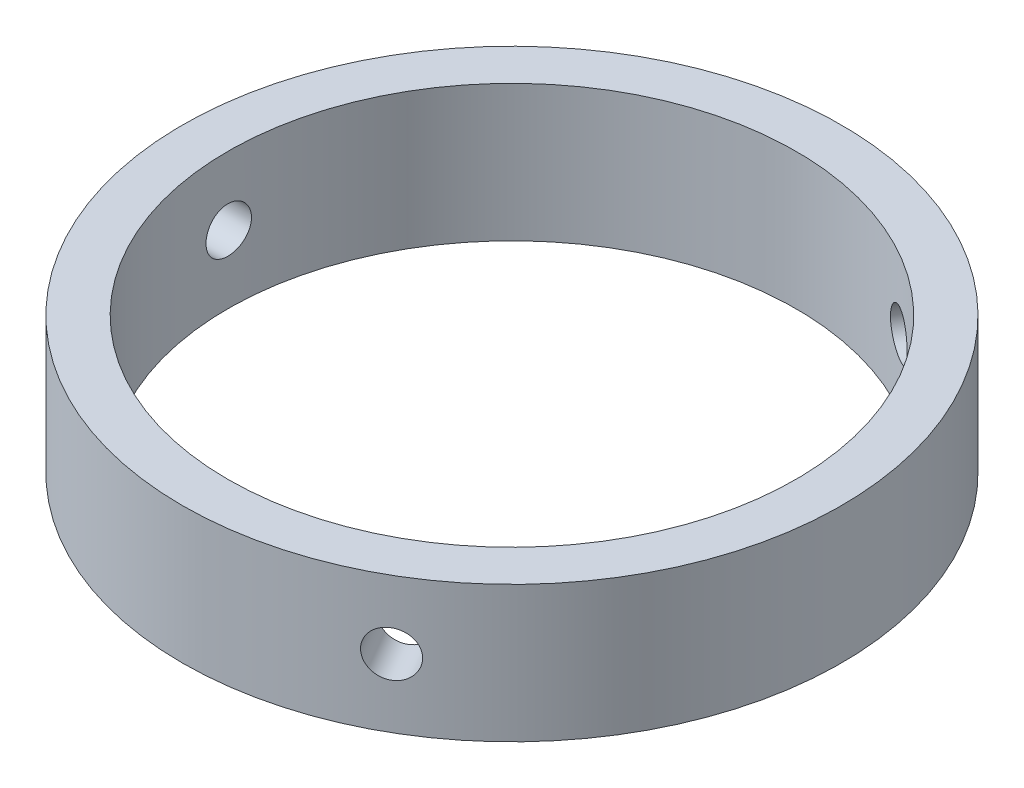
ISO-10303-21;
HEADER;
FILE_DESCRIPTION(('STEP AP214'),'2;1');
FILE_NAME('part.step','',(''),(''),'','','');
FILE_SCHEMA(('AUTOMOTIVE_DESIGN { 1 0 10303 214 1 1 1 1 }'));
ENDSEC;
DATA;
#1=APPLICATION_CONTEXT('core data for automotive mechanical design processes');
#2=APPLICATION_PROTOCOL_DEFINITION('international standard','automotive_design',2000,#1);
#3=PRODUCT_CONTEXT('',#1,'mechanical');
#4=PRODUCT('Part','Part','',(#3));
#5=PRODUCT_RELATED_PRODUCT_CATEGORY('part','',(#4));
#6=PRODUCT_DEFINITION_FORMATION('','',#4);
#7=PRODUCT_DEFINITION_CONTEXT('part definition',#1,'design');
#8=PRODUCT_DEFINITION('design','',#6,#7);
#9=PRODUCT_DEFINITION_SHAPE('','',#8);
#10=(LENGTH_UNIT() NAMED_UNIT(*) SI_UNIT(.MILLI.,.METRE.));
#11=(NAMED_UNIT(*) PLANE_ANGLE_UNIT() SI_UNIT($,.RADIAN.));
#12=(NAMED_UNIT(*) SI_UNIT($,.STERADIAN.) SOLID_ANGLE_UNIT());
#13=UNCERTAINTY_MEASURE_WITH_UNIT(LENGTH_MEASURE(1.E-05),#10,'distance_accuracy_value','');
#14=(GEOMETRIC_REPRESENTATION_CONTEXT(3) GLOBAL_UNCERTAINTY_ASSIGNED_CONTEXT((#13)) GLOBAL_UNIT_ASSIGNED_CONTEXT((#10,
#11,#12)) REPRESENTATION_CONTEXT('',''));
#15=CARTESIAN_POINT('',(0.,0.,0.));
#16=DIRECTION('',(0.,0.,1.));
#17=DIRECTION('',(1.,0.,0.));
#18=AXIS2_PLACEMENT_3D('',#15,#16,#17);
#19=CARTESIAN_POINT('',(0.,19.05,0.));
#20=DIRECTION('',(0.,1.,0.));
#21=DIRECTION('',(0.,0.,1.));
#22=AXIS2_PLACEMENT_3D('',#19,#20,#21);
#23=PLANE('',#22);
#24=CARTESIAN_POINT('',(0.,19.05,0.));
#25=DIRECTION('',(0.,1.,0.));
#26=DIRECTION('',(0.,0.,1.));
#27=AXIS2_PLACEMENT_3D('',#24,#25,#26);
#28=CIRCLE('',#27,46.0375);
#29=CARTESIAN_POINT('',(0.,19.05,46.0375));
#30=VERTEX_POINT('',#29);
#31=EDGE_CURVE('E10',#30,#30,#28,.T.);
#32=ORIENTED_EDGE('',*,*,#31,.T.);
#33=EDGE_LOOP('',(#32));
#34=FACE_BOUND('',#33,.T.);
#35=CARTESIAN_POINT('',(0.,19.05,0.));
#36=DIRECTION('',(0.,1.,0.));
#37=DIRECTION('',(0.,0.,1.));
#38=AXIS2_PLACEMENT_3D('',#35,#36,#37);
#39=CIRCLE('',#38,39.6875);
#40=CARTESIAN_POINT('',(0.,19.05,39.6875));
#41=VERTEX_POINT('',#40);
#42=EDGE_CURVE('E56',#41,#41,#39,.T.);
#43=ORIENTED_EDGE('',*,*,#42,.F.);
#44=EDGE_LOOP('',(#43));
#45=FACE_BOUND('',#44,.T.);
#46=ADVANCED_FACE('F37',(#34,#45),#23,.T.);
#47=CARTESIAN_POINT('',(0.,0.,0.));
#48=DIRECTION('',(0.,1.,0.));
#49=DIRECTION('',(0.,0.,1.));
#50=AXIS2_PLACEMENT_3D('',#47,#48,#49);
#51=PLANE('',#50);
#52=CARTESIAN_POINT('',(0.,0.,0.));
#53=DIRECTION('',(0.,1.,0.));
#54=DIRECTION('',(0.,0.,1.));
#55=AXIS2_PLACEMENT_3D('',#52,#53,#54);
#56=CIRCLE('',#55,46.0375);
#57=CARTESIAN_POINT('',(0.,0.,46.0375));
#58=VERTEX_POINT('',#57);
#59=EDGE_CURVE('E51',#58,#58,#56,.T.);
#60=ORIENTED_EDGE('',*,*,#59,.F.);
#61=EDGE_LOOP('',(#60));
#62=FACE_BOUND('',#61,.T.);
#63=CARTESIAN_POINT('',(0.,0.,0.));
#64=DIRECTION('',(0.,1.,0.));
#65=DIRECTION('',(0.,0.,1.));
#66=AXIS2_PLACEMENT_3D('',#63,#64,#65);
#67=CIRCLE('',#66,39.6875);
#68=CARTESIAN_POINT('',(0.,0.,39.6875));
#69=VERTEX_POINT('',#68);
#70=EDGE_CURVE('E59',#69,#69,#67,.T.);
#71=ORIENTED_EDGE('',*,*,#70,.T.);
#72=EDGE_LOOP('',(#71));
#73=FACE_BOUND('',#72,.T.);
#74=ADVANCED_FACE('F101',(#62,#73),#51,.F.);
#75=CARTESIAN_POINT('',(0.,19.05,0.));
#76=DIRECTION('',(0.,-1.,0.));
#77=DIRECTION('',(0.,0.,-1.));
#78=AXIS2_PLACEMENT_3D('',#75,#76,#77);
#79=CYLINDRICAL_SURFACE('',#78,46.0375);
#80=CARTESIAN_POINT('',(-45.927886749229,9.525,-3.175));
#81=CARTESIAN_POINT('',(-45.9278882117894,9.70311347048142,-3.17499217767791));
#82=CARTESIAN_POINT('',(-45.9289340108004,9.88135068965605,-3.15996170831043));
#83=CARTESIAN_POINT('',(-45.9330045505176,10.2329007552668,-3.10021951767123));
#84=CARTESIAN_POINT('',(-45.9360315774783,10.4062076709556,-3.05547350502673));
#85=CARTESIAN_POINT('',(-45.9437200863684,10.7427541707013,-2.93759409103095));
#86=CARTESIAN_POINT('',(-45.9483806875519,10.9059991240354,-2.86447598429968));
#87=CARTESIAN_POINT('',(-45.9588100949007,11.2178571674679,-2.69195339959439));
#88=CARTESIAN_POINT('',(-45.9645786519499,11.3664735353601,-2.59255482870735));
#89=CARTESIAN_POINT('',(-45.9765857110736,11.6451649626507,-2.37009773676865));
#90=CARTESIAN_POINT('',(-45.9828249464472,11.7752101374431,-2.24700181305405));
#91=CARTESIAN_POINT('',(-45.995063563711,12.0128115764183,-1.98072218918307));
#92=CARTESIAN_POINT('',(-46.0010629354572,12.1203668902903,-1.83753764060733));
#93=CARTESIAN_POINT('',(-46.0121523881866,12.3100298674662,-1.53497340579874));
#94=CARTESIAN_POINT('',(-46.0172415704449,12.3921124370123,-1.37557795374001));
#95=CARTESIAN_POINT('',(-46.0259294342189,12.5283392991642,-1.04522695645917));
#96=CARTESIAN_POINT('',(-46.0295281345186,12.5824839438664,-0.874271556955647));
#97=CARTESIAN_POINT('',(-46.0348244674008,12.6612140599927,-0.525944540446999));
#98=CARTESIAN_POINT('',(-46.0365251429467,12.6858468502784,-0.348583665617087));
#99=CARTESIAN_POINT('',(-46.0378440715752,12.705000195017,0.00776296761118296));
#100=CARTESIAN_POINT('',(-46.0374623524045,12.6995211506919,0.186748704327512));
#101=CARTESIAN_POINT('',(-46.0346620327918,12.6586452894488,0.540943712182851));
#102=CARTESIAN_POINT('',(-46.0322468974202,12.6232993672165,0.716158888016783));
#103=CARTESIAN_POINT('',(-46.0256555643908,12.5237721154098,1.05816333067813));
#104=CARTESIAN_POINT('',(-46.021479354521,12.4595905858751,1.22495253906679));
#105=CARTESIAN_POINT('',(-46.0118300077675,12.3041566196463,1.5455335004134));
#106=CARTESIAN_POINT('',(-46.0063557703298,12.2128811943145,1.69931407284338));
#107=CARTESIAN_POINT('',(-45.9947262025275,12.0058671222919,1.9893904205532));
#108=CARTESIAN_POINT('',(-45.9885708627757,11.8901281384192,2.12568595479475));
#109=CARTESIAN_POINT('',(-45.9762564285822,11.6371850780586,2.37722049513397));
#110=CARTESIAN_POINT('',(-45.9700973530046,11.4999368131453,2.49241507094369));
#111=CARTESIAN_POINT('',(-45.9584826160424,11.2080257474265,2.69813498713833));
#112=CARTESIAN_POINT('',(-45.9530269550079,11.0533629379528,2.78866031524395));
#113=CARTESIAN_POINT('',(-45.9434353180387,10.7309840219405,2.94246930316487));
#114=CARTESIAN_POINT('',(-45.9392994386493,10.5632669615671,3.00575097015748));
#115=CARTESIAN_POINT('',(-45.9328170776816,10.2195539011968,3.10324500770995));
#116=CARTESIAN_POINT('',(-45.9304705704406,10.0435580199705,3.13745779516722));
#117=CARTESIAN_POINT('',(-45.9278364104729,9.68867109423489,3.17578729509563));
#118=CARTESIAN_POINT('',(-45.9275445289821,9.50978675616839,3.17996582347681));
#119=CARTESIAN_POINT('',(-45.9290414841765,9.1538598571218,3.15826981908035));
#120=CARTESIAN_POINT('',(-45.9308303076419,8.97681728444736,3.1323954772421));
#121=CARTESIAN_POINT('',(-45.9362832352072,8.62977505074453,3.05137961099909));
#122=CARTESIAN_POINT('',(-45.9399455082287,8.45976868768736,2.99626666197553));
#123=CARTESIAN_POINT('',(-45.9487311044787,8.13141765639259,2.85836700764728));
#124=CARTESIAN_POINT('',(-45.9538544438319,7.97307311688193,2.7755799969233));
#125=CARTESIAN_POINT('',(-45.9649951056629,7.67225690264444,2.58452470434109));
#126=CARTESIAN_POINT('',(-45.9710138731838,7.5298115487195,2.47621506593184));
#127=CARTESIAN_POINT('',(-45.9832621592864,7.265102596431,2.2372490919754));
#128=CARTESIAN_POINT('',(-45.9894916803663,7.14283923739551,2.10659249146431));
#129=CARTESIAN_POINT('',(-46.0014719564844,6.92175546351427,1.82637510215911));
#130=CARTESIAN_POINT('',(-46.0072218829579,6.82297509556662,1.67678267722111));
#131=CARTESIAN_POINT('',(-46.0175831767384,6.65193555413031,1.36309869154094));
#132=CARTESIAN_POINT('',(-46.0221945523016,6.57967618832209,1.19900723595058));
#133=CARTESIAN_POINT('',(-46.029755250076,6.4637992440986,0.861129323712912));
#134=CARTESIAN_POINT('',(-46.0327060332563,6.42015648353776,0.687351537409144));
#135=CARTESIAN_POINT('',(-46.0366189267395,6.36266922595499,0.334913796263059));
#136=CARTESIAN_POINT('',(-46.0375810616588,6.3488243600814,0.156253901881383));
#137=CARTESIAN_POINT('',(-46.0374083172308,6.35132964742889,-0.200480663481208));
#138=CARTESIAN_POINT('',(-46.0362777851817,6.3676172036363,-0.378555779548015));
#139=CARTESIAN_POINT('',(-46.0320554204609,6.42979499099535,-0.729435978616245));
#140=CARTESIAN_POINT('',(-46.0289635845262,6.47568527139758,-0.902241052849301));
#141=CARTESIAN_POINT('',(-46.0211659498581,6.59575116384667,-1.23768364259167));
#142=CARTESIAN_POINT('',(-46.0164601812451,6.66992624802374,-1.40032134778525));
#143=CARTESIAN_POINT('',(-46.005962501132,6.84444810355691,-1.71084381667775));
#144=CARTESIAN_POINT('',(-46.0001706147058,6.94479427074846,-1.85872892083439));
#145=CARTESIAN_POINT('',(-45.9881374935953,7.16904289377915,-2.13586700221107));
#146=CARTESIAN_POINT('',(-45.9818954020557,7.29299104665192,-2.26508296516869));
#147=CARTESIAN_POINT('',(-45.9696724504867,7.56085529586682,-2.50092107200243));
#148=CARTESIAN_POINT('',(-45.9636916545653,7.70477625670419,-2.60753769563923));
#149=CARTESIAN_POINT('',(-45.9526591036659,8.00869684993096,-2.79524754821469));
#150=CARTESIAN_POINT('',(-45.9476086750847,8.16871894264595,-2.87630445274713));
#151=CARTESIAN_POINT('',(-45.9390253945794,8.50002180778776,-3.01029936524573));
#152=CARTESIAN_POINT('',(-45.9354907752685,8.67128919827424,-3.06327013790761));
#153=CARTESIAN_POINT('',(-45.9312608414718,8.95716185524869,-3.12589858504251));
#154=CARTESIAN_POINT('',(-45.930001256075,9.06992168355266,-3.14428762040432));
#155=CARTESIAN_POINT('',(-45.9283137420502,9.29677073655801,-3.16884082366096));
#156=CARTESIAN_POINT('',(-45.9278858119797,9.41085995895314,-3.17500501276047));
#157=CARTESIAN_POINT('',(-45.927886749229,9.525,-3.175));
#158=B_SPLINE_CURVE_WITH_KNOTS('',3,(#80,#81,#82,#83,#84,#85,#86,#87,#88,#89,#90,#91,#92,#93,
#94,#95,#96,#97,#98,#99,#100,#101,#102,#103,#104,#105,#106,#107,#108,#109,#110,#111,#112,#113,
#114,#115,#116,#117,#118,#119,#120,#121,#122,#123,#124,#125,#126,#127,#128,#129,#130,#131,#132,
#133,#134,#135,#136,#137,#138,#139,#140,#141,#142,#143,#144,#145,#146,#147,#148,#149,#150,#151,
#152,#153,#154,#155,#156,#157),.UNSPECIFIED.,.T.,.F.,(4,2,2,2,2,2,2,2,2,2,2,2,2,2,2,2,2,2,2,2,2,
2,2,2,2,2,2,2,2,2,2,2,2,2,2,2,2,2,4),(0.,0.533923711716308,1.06846463800663,1.60271780732995,
2.1368509939564,2.6718342447661,3.20684009676727,3.74237133382765,4.27789582152216,
4.81256050326147,5.34721806093408,5.88096636788996,6.41471837617887,6.94892456340053,
7.48313811407849,8.01846389225095,8.55378993688487,9.08915513296355,9.62451265086067,
10.1587679902998,10.6930199353932,11.2267507063691,11.7604873679533,12.2950949102194,
12.8297087916705,13.365227943754,13.9007432123929,14.4357866016373,14.9708233678373,
15.5047498979539,16.0386773163762,16.5725947707779,17.1064999006818,17.6414494608327,
18.1765295405177,18.7123666618025,19.2475773036409,19.5897309875491,19.9318840779721),.UNSPECIFIED.);
#159=CARTESIAN_POINT('',(-45.927886749229,9.525,-3.175));
#160=VERTEX_POINT('',#159);
#161=EDGE_CURVE('E161',#160,#160,#158,.T.);
#162=ORIENTED_EDGE('',*,*,#161,.T.);
#163=EDGE_LOOP('',(#162));
#164=FACE_BOUND('',#163,.T.);
#165=CARTESIAN_POINT('',(20.2143127175991,9.525,41.3622166669669));
#166=CARTESIAN_POINT('',(20.2143202232089,9.70311347048142,41.3622140224203));
#167=CARTESIAN_POINT('',(20.2278598910175,9.88135068965605,41.3556044762473));
#168=CARTESIAN_POINT('',(20.2816334156474,10.2329007552668,41.32925857173));
#169=CARTESIAN_POINT('',(20.3218981127959,10.4062076709556,41.3095070476537));
#170=CARTESIAN_POINT('',(20.4278289343446,10.7427541707013,41.2572257846718));
#171=CARTESIAN_POINT('',(20.4934813728422,10.9059991240354,41.224702930328));
#172=CARTESIAN_POINT('',(20.6481050175979,11.2178571674679,41.1474737696858));
#173=CARTESIAN_POINT('',(20.7370709836106,11.3664735353601,41.1027702011901));
#174=CARTESIAN_POINT('',(20.9357280060434,11.6451649626507,41.0019400734466));
#175=CARTESIAN_POINT('',(21.0454518207693,11.7752101374431,40.945795447923));
#176=CARTESIAN_POINT('',(21.2821760481836,12.0128115764183,40.8232545894452));
#177=CARTESIAN_POINT('',(21.4091771905527,12.1203668902903,40.7568579234962));
#178=CARTESIAN_POINT('',(21.6767502305383,12.3100298674662,40.6151795538697));
#179=CARTESIAN_POINT('',(21.817335332398,12.3921124370123,40.5398891889605));
#180=CARTESIAN_POINT('',(22.1077716200957,12.5283392991642,40.3822376010529));
#181=CARTESIAN_POINT('',(22.2576226891298,12.5824839438664,40.2998764671814));
#182=CARTESIAN_POINT('',(22.5619309006918,12.6612140599927,40.1302997177499));
#183=CARTESIAN_POINT('',(22.7163802617048,12.6858468502784,40.0430921085613));
#184=CARTESIAN_POINT('',(23.0256449629479,12.705000195017,39.8660610176453));
#185=CARTESIAN_POINT('',(23.1804602982739,12.6995211506919,39.7762375707881));
#186=CARTESIAN_POINT('',(23.4858020131639,12.6586452894488,39.5967149189372));
#187=CARTESIAN_POINT('',(23.6363352388788,12.6232993672165,39.5070157624348));
#188=CARTESIAN_POINT('',(23.929224107916,12.5237721154098,39.3303052792559));
#189=CARTESIAN_POINT('',(24.0715796945228,12.4595905858751,39.2432939712227));
#190=CARTESIAN_POINT('',(24.3443862776418,12.3041566196463,39.074646911131));
#191=CARTESIAN_POINT('',(24.4748270412559,12.2128811943145,38.9930157962286));
#192=CARTESIAN_POINT('',(24.7202257435084,12.0058671222919,38.8379061212218));
#193=CARTESIAN_POINT('',(24.8351834687081,11.8901281384192,38.7644276735071));
#194=CARTESIAN_POINT('',(25.0468615534743,11.6371850780586,38.6279957904927));
#195=CARTESIAN_POINT('',(25.143543444715,11.4999368131453,38.5650645866738));
#196=CARTESIAN_POINT('',(25.3158947497228,11.2080257474265,38.452145971309));
#197=CARTESIAN_POINT('',(25.3915641530309,11.0533629379528,38.4021585662058));
#198=CARTESIAN_POINT('',(25.5199708254162,10.7309840219405,38.3169474709662));
#199=CARTESIAN_POINT('',(25.5727064169309,10.5632669615671,38.2817248608516));
#200=CARTESIAN_POINT('',(25.653897549685,10.2195539011968,38.2273639528008));
#201=CARTESIAN_POINT('',(25.6823534391368,10.0435580199705,38.2082254241914));
#202=CARTESIAN_POINT('',(25.7142306798053,9.68867109423489,38.1867794247775));
#203=CARTESIAN_POINT('',(25.7177034507885,9.50978675616839,38.184437383801));
#204=CARTESIAN_POINT('',(25.6996626374177,9.1538598571218,38.1965817872258));
#205=CARTESIAN_POINT('',(25.6781492118123,8.97681728444736,38.2110681247089));
#206=CARTESIAN_POINT('',(25.6107138773189,8.62977505074453,38.256298431627));
#207=CARTESIAN_POINT('',(25.5648157998977,8.45976868768736,38.2870265276109));
#208=CARTESIAN_POINT('',(25.4497839942014,8.13141765639259,38.363584904315));
#209=CARTESIAN_POINT('',(25.3806500094876,7.97307311688193,38.409415351709));
#210=CARTESIAN_POINT('',(25.2207616034995,7.67225690264444,38.5145910941608));
#211=CARTESIAN_POINT('',(25.1299720889228,7.5298115487195,38.573958318938));
#212=CARTESIAN_POINT('',(24.9291456278878,7.265102596431,38.7040486328339));
#213=CARTESIAN_POINT('',(24.819108453213,7.14283923739551,38.7747718565981));
#214=CARTESIAN_POINT('',(24.5824232135516,6.92175546351427,38.9252557747132));
#215=CARTESIAN_POINT('',(24.4557473365783,6.82297509556662,39.0050315695782));
#216=CARTESIAN_POINT('',(24.1892696831092,6.6519355541303,39.1708467060483));
#217=CARTESIAN_POINT('',(24.0494680018056,6.57967618832208,39.2568860022276));
#218=CARTESIAN_POINT('',(23.7606374953173,6.4637992440986,39.4323727146894));
#219=CARTESIAN_POINT('',(23.6116169093549,6.42015648353775,39.5218170610364));
#220=CARTESIAN_POINT('',(23.3083533190116,6.36266922595499,39.7014245967682));
#221=CARTESIAN_POINT('',(23.1541103792993,6.34882436008139,39.7915877772411));
#222=CARTESIAN_POINT('',(22.8450828110733,6.35132964742889,39.9698054588594));
#223=CARTESIAN_POINT('',(22.6902999707531,6.3676172036363,40.0578639474185));
#224=CARTESIAN_POINT('',(22.3843176223146,6.42979499099535,40.2296473718403));
#225=CARTESIAN_POINT('',(22.2331181201586,6.47568527139758,40.3133723004931));
#226=CARTESIAN_POINT('',(21.9387174985964,6.59575116384668,40.4743406456522));
#227=CARTESIAN_POINT('',(21.7955162299791,6.66992624802374,40.5515841830859));
#228=CARTESIAN_POINT('',(21.5213470434157,6.84444810355691,40.6977541598733));
#229=CARTESIAN_POINT('',(21.3903788431617,6.94479427074847,40.7666807911708));
#230=CARTESIAN_POINT('',(21.1443536637781,7.16904289377915,40.8948288432906));
#231=CARTESIAN_POINT('',(21.0293283115126,7.29299104665192,40.9540310149234));
#232=CARTESIAN_POINT('',(20.8189750440296,7.56085529586682,41.0613646817722));
#233=CARTESIAN_POINT('',(20.7236519415337,7.70477625670419,41.1094934723878));
#234=CARTESIAN_POINT('',(20.555574165213,8.00869684993096,41.1937939293281));
#235=CARTESIAN_POINT('',(20.4828516124453,8.16871894264595,41.2299485821431));
#236=CARTESIAN_POINT('',(20.3625169739909,8.50002180778776,41.2895126994269));
#237=CARTESIAN_POINT('',(20.3148756295522,8.67128919827424,41.312937015642));
#238=CARTESIAN_POINT('',(20.2585228364355,8.95716185524869,41.3405880090852));
#239=CARTESIAN_POINT('',(20.2419676719626,9.06992168355266,41.3486916938142));
#240=CARTESIAN_POINT('',(20.2198602171857,9.29677073655801,41.3595068654278));
#241=CARTESIAN_POINT('',(20.2143079077966,9.41085995895314,41.3622183616655));
#242=CARTESIAN_POINT('',(20.2143127175991,9.525,41.3622166669669));
#243=B_SPLINE_CURVE_WITH_KNOTS('',3,(#165,#166,#167,#168,#169,#170,#171,#172,#173,#174,#175,
#176,#177,#178,#179,#180,#181,#182,#183,#184,#185,#186,#187,#188,#189,#190,#191,#192,#193,#194,
#195,#196,#197,#198,#199,#200,#201,#202,#203,#204,#205,#206,#207,#208,#209,#210,#211,#212,#213,
#214,#215,#216,#217,#218,#219,#220,#221,#222,#223,#224,#225,#226,#227,#228,#229,#230,#231,#232,
#233,#234,#235,#236,#237,#238,#239,#240,#241,#242),.UNSPECIFIED.,.T.,.F.,(4,2,2,2,2,2,2,2,2,2,2,
2,2,2,2,2,2,2,2,2,2,2,2,2,2,2,2,2,2,2,2,2,2,2,2,2,2,2,4),(0.,0.533923711716309,1.06846463800663,
1.60271780732995,2.1368509939564,2.6718342447661,3.20684009676727,3.74237133382765,
4.27789582152216,4.81256050326147,5.34721806093409,5.88096636788997,6.41471837617886,
6.94892456340053,7.4831381140785,8.01846389225095,8.55378993688487,9.08915513296356,
9.62451265086068,10.1587679902998,10.6930199353932,11.2267507063691,11.7604873679533,
12.2950949102194,12.8297087916705,13.365227943754,13.9007432123929,14.4357866016373,
14.9708233678373,15.5047498979539,16.0386773163762,16.5725947707779,17.1064999006818,
17.6414494608327,18.1765295405177,18.7123666618026,19.2475773036409,19.5897309875491,
19.9318840779721),.UNSPECIFIED.);
#244=CARTESIAN_POINT('',(20.2143127175991,9.525,41.3622166669669));
#245=VERTEX_POINT('',#244);
#246=EDGE_CURVE('E69',#245,#245,#243,.T.);
#247=ORIENTED_EDGE('',*,*,#246,.T.);
#248=EDGE_LOOP('',(#247));
#249=FACE_BOUND('',#248,.T.);
#250=CARTESIAN_POINT('',(25.7135740316302,9.525,-38.1872166669668));
#251=CARTESIAN_POINT('',(25.7135679885808,9.70311347048142,-38.1872218447424));
#252=CARTESIAN_POINT('',(25.7010741197833,9.88135068965605,-38.1956427679369));
#253=CARTESIAN_POINT('',(25.6513711348706,10.2329007552668,-38.2290390540587));
#254=CARTESIAN_POINT('',(25.6141334646828,10.4062076709556,-38.2540335426269));
#255=CARTESIAN_POINT('',(25.5158911520243,10.7427541707013,-38.3196316936409));
#256=CARTESIAN_POINT('',(25.4548993147101,10.9059991240354,-38.3602269460283));
#257=CARTESIAN_POINT('',(25.3107050773031,11.2178571674679,-38.4555203700914));
#258=CARTESIAN_POINT('',(25.2275076683397,11.3664735353601,-38.5102153724827));
#259=CARTESIAN_POINT('',(25.0408577050307,11.6451649626507,-38.631842336678));
#260=CARTESIAN_POINT('',(24.9373731256783,11.7752101374431,-38.6987936348689));
#261=CARTESIAN_POINT('',(24.7128875155277,12.0128115764183,-38.8425324002621));
#262=CARTESIAN_POINT('',(24.5918857449048,12.1203668902903,-38.9193202828889));
#263=CARTESIAN_POINT('',(24.3354021576487,12.3100298674662,-39.0802061480709));
#264=CARTESIAN_POINT('',(24.1999062380473,12.3921124370123,-39.1643112352205));
#265=CARTESIAN_POINT('',(23.9181578141235,12.5283392991642,-39.3370106445938));
#266=CARTESIAN_POINT('',(23.7719054453893,12.5824839438664,-39.4256049102258));
#267=CARTESIAN_POINT('',(23.4728935667094,12.6612140599927,-39.6043551773029));
#268=CARTESIAN_POINT('',(23.3201448812422,12.6858468502784,-39.6945084429442));
#269=CARTESIAN_POINT('',(23.0121991086278,12.705000195017,-39.8738239852565));
#270=CARTESIAN_POINT('',(22.857002054131,12.6995211506919,-39.9629862751157));
#271=CARTESIAN_POINT('',(22.5488600196283,12.6586452894488,-40.13765863112));
#272=CARTESIAN_POINT('',(22.3959116585417,12.6232993672165,-40.2231746504516));
#273=CARTESIAN_POINT('',(22.0964314564752,12.5237721154098,-40.388468609934));
#274=CARTESIAN_POINT('',(21.9498996599986,12.4595905858751,-40.4682465102895));
#275=CARTESIAN_POINT('',(21.667443730126,12.3041566196463,-40.6201804115444));
#276=CARTESIAN_POINT('',(21.5315287290743,12.2128811943145,-40.692329869072));
#277=CARTESIAN_POINT('',(21.2745004590194,12.0058671222919,-40.8272965417751));
#278=CARTESIAN_POINT('',(21.153387394068,11.8901281384192,-40.8901136283019));
#279=CARTESIAN_POINT('',(20.9293948751083,11.6371850780586,-41.0052162856267));
#280=CARTESIAN_POINT('',(20.8265539082901,11.4999368131453,-41.0574796576176));
#281=CARTESIAN_POINT('',(20.64258786632,11.2080257474265,-41.1502809584473));
#282=CARTESIAN_POINT('',(20.5614628019774,11.0533629379528,-41.1908188814498));
#283=CARTESIAN_POINT('',(20.4234644926229,10.7309840219405,-41.2594167741311));
#284=CARTESIAN_POINT('',(20.3665930217187,10.5632669615671,-41.2874758310091));
#285=CARTESIAN_POINT('',(20.2789195279969,10.2195539011968,-41.3306089605108));
#286=CARTESIAN_POINT('',(20.2481171313042,10.0435580199705,-41.3456832193586));
#287=CARTESIAN_POINT('',(20.2136057306679,9.68867109423488,-41.3625667198732));
#288=CARTESIAN_POINT('',(20.209841078194,9.50978675616839,-41.3644032072778));
#289=CARTESIAN_POINT('',(20.2293788467591,9.1538598571218,-41.3548516063062));
#290=CARTESIAN_POINT('',(20.25268109583,8.97681728444736,-41.343463601951));
#291=CARTESIAN_POINT('',(20.3255693578887,8.62977505074453,-41.3076780426261));
#292=CARTESIAN_POINT('',(20.3751297083313,8.45976868768736,-41.2832931895865));
#293=CARTESIAN_POINT('',(20.4989471102777,8.13141765639259,-41.2219519119623));
#294=CARTESIAN_POINT('',(20.5732044343446,7.97307311688193,-41.1849953486324));
#295=CARTESIAN_POINT('',(20.7442335021638,7.67225690264444,-41.0991157985019));
#296=CARTESIAN_POINT('',(20.8410417842614,7.5298115487195,-41.0501733848699));
#297=CARTESIAN_POINT('',(21.054116531399,7.265102596431,-40.9412977248093));
#298=CARTESIAN_POINT('',(21.1703832271537,7.14283923739551,-40.8813643480624));
#299=CARTESIAN_POINT('',(21.4190487429332,6.92175546351427,-40.7516308768723));
#300=CARTESIAN_POINT('',(21.55147454638,6.82297509556662,-40.6818142467993));
#301=CARTESIAN_POINT('',(21.8283134936296,6.65193555413031,-40.5339453975892));
#302=CARTESIAN_POINT('',(21.9727265504964,6.57967618832209,-40.4558932381782));
#303=CARTESIAN_POINT('',(22.2691177547591,6.4637992440986,-40.2935020384023));
#304=CARTESIAN_POINT('',(22.4210891239017,6.42015648353776,-40.2091685984456));
#305=CARTESIAN_POINT('',(22.7282656077282,6.36266922595499,-40.0363383930313));
#306=CARTESIAN_POINT('',(22.8834706823599,6.3488243600814,-39.9478416791225));
#307=CARTESIAN_POINT('',(23.1923255061579,6.35132964742889,-39.7693247953782));
#308=CARTESIAN_POINT('',(23.345977814429,6.3676172036363,-39.6793081678705));
#309=CARTESIAN_POINT('',(23.6477377981467,6.42979499099535,-39.5002113932241));
#310=CARTESIAN_POINT('',(23.795845464368,6.47568527139758,-39.4111312476438));
#311=CARTESIAN_POINT('',(24.0824484512621,6.59575116384667,-39.2366570030606));
#312=CARTESIAN_POINT('',(24.2209439512664,6.66992624802374,-39.1512628353006));
#313=CARTESIAN_POINT('',(24.4846154577166,6.84444810355691,-38.9869103431955));
#314=CARTESIAN_POINT('',(24.6097917715445,6.94479427074847,-38.9079518703364));
#315=CARTESIAN_POINT('',(24.8437838298175,7.16904289377916,-38.7589618410795));
#316=CARTESIAN_POINT('',(24.9525670905435,7.29299104665192,-38.6889480497547));
#317=CARTESIAN_POINT('',(25.1506974064574,7.56085529586683,-38.5604436097698));
#318=CARTESIAN_POINT('',(25.2400397130319,7.70477625670419,-38.5019557767486));
#319=CARTESIAN_POINT('',(25.3970849384532,8.00869684993096,-38.3985463811134));
#320=CARTESIAN_POINT('',(25.4647570626398,8.16871894264595,-38.3536441293959));
#321=CARTESIAN_POINT('',(25.5765084205888,8.50002180778776,-38.2792133341812));
#322=CARTESIAN_POINT('',(25.6206151457167,8.67128919827424,-38.2496668777343));
#323=CARTESIAN_POINT('',(25.6727380050367,8.95716185524869,-38.2146894240427));
#324=CARTESIAN_POINT('',(25.6880335841127,9.06992168355266,-38.2044040734099));
#325=CARTESIAN_POINT('',(25.7084535248649,9.29677073655801,-38.1906660417668));
#326=CARTESIAN_POINT('',(25.7135779041835,9.41085995895314,-38.187213348905));
#327=CARTESIAN_POINT('',(25.7135740316302,9.525,-38.1872166669668));
#328=B_SPLINE_CURVE_WITH_KNOTS('',3,(#250,#251,#252,#253,#254,#255,#256,#257,#258,#259,#260,
#261,#262,#263,#264,#265,#266,#267,#268,#269,#270,#271,#272,#273,#274,#275,#276,#277,#278,#279,
#280,#281,#282,#283,#284,#285,#286,#287,#288,#289,#290,#291,#292,#293,#294,#295,#296,#297,#298,
#299,#300,#301,#302,#303,#304,#305,#306,#307,#308,#309,#310,#311,#312,#313,#314,#315,#316,#317,
#318,#319,#320,#321,#322,#323,#324,#325,#326,#327),.UNSPECIFIED.,.T.,.F.,(4,2,2,2,2,2,2,2,2,2,2,
2,2,2,2,2,2,2,2,2,2,2,2,2,2,2,2,2,2,2,2,2,2,2,2,2,2,2,4),(0.,0.533923711716308,1.06846463800663,
1.60271780732995,2.1368509939564,2.67183424476611,3.20684009676727,3.74237133382765,
4.27789582152216,4.81256050326147,5.34721806093409,5.88096636788996,6.41471837617887,
6.94892456340053,7.48313811407849,8.01846389225095,8.55378993688487,9.08915513296355,
9.62451265086068,10.1587679902998,10.6930199353932,11.2267507063691,11.7604873679533,
12.2950949102194,12.8297087916705,13.365227943754,13.9007432123929,14.4357866016373,
14.9708233678373,15.5047498979539,16.0386773163762,16.5725947707779,17.1064999006818,
17.6414494608327,18.1765295405177,18.7123666618025,19.2475773036409,19.5897309875491,
19.9318840779721),.UNSPECIFIED.);
#329=CARTESIAN_POINT('',(25.7135740316302,9.525,-38.1872166669668));
#330=VERTEX_POINT('',#329);
#331=EDGE_CURVE('E68',#330,#330,#328,.T.);
#332=ORIENTED_EDGE('',*,*,#331,.T.);
#333=EDGE_LOOP('',(#332));
#334=FACE_BOUND('',#333,.T.);
#335=ORIENTED_EDGE('',*,*,#31,.F.);
#336=EDGE_LOOP('',(#335));
#337=FACE_BOUND('',#336,.T.);
#338=ORIENTED_EDGE('',*,*,#59,.T.);
#339=EDGE_LOOP('',(#338));
#340=FACE_BOUND('',#339,.T.);
#341=ADVANCED_FACE('F39',(#164,#249,#334,#337,#340),#79,.T.);
#342=CARTESIAN_POINT('',(0.,19.05,0.));
#343=DIRECTION('',(0.,-1.,0.));
#344=DIRECTION('',(0.,0.,-1.));
#345=AXIS2_PLACEMENT_3D('',#342,#343,#344);
#346=CYLINDRICAL_SURFACE('',#345,39.6875);
#347=CARTESIAN_POINT('',(-39.5602961471473,9.525,-3.175));
#348=CARTESIAN_POINT('',(-39.5602978354763,9.70303471770775,-3.17499221199535));
#349=CARTESIAN_POINT('',(-39.5615109077569,9.88119125864688,-3.15997497322137));
#350=CARTESIAN_POINT('',(-39.5662321887691,10.2325767795592,-3.10028841405784));
#351=CARTESIAN_POINT('',(-39.5697430107159,10.4057999144522,-3.05558533131068));
#352=CARTESIAN_POINT('',(-39.5786596140503,10.7421784111076,-2.93782663267174));
#353=CARTESIAN_POINT('',(-39.5840643342438,10.9053393508629,-2.86478689200177));
#354=CARTESIAN_POINT('',(-39.5961584260585,11.2170459359029,-2.69245600790662));
#355=CARTESIAN_POINT('',(-39.6028475194627,11.3655947359059,-2.59317054799924));
#356=CARTESIAN_POINT('',(-39.6167745289534,11.644252827593,-2.37091118043317));
#357=CARTESIAN_POINT('',(-39.6240135711371,11.7743226288649,-2.24788782774951));
#358=CARTESIAN_POINT('',(-39.6382144821767,12.0119914390947,-1.98174916019273));
#359=CARTESIAN_POINT('',(-39.6451763390122,12.1195894743966,-1.8386329751871));
#360=CARTESIAN_POINT('',(-39.6580490076274,12.3093904926603,-1.53613732327408));
#361=CARTESIAN_POINT('',(-39.6639584089875,12.3915595047142,-1.37673647616993));
#362=CARTESIAN_POINT('',(-39.6740482359442,12.5279526883029,-1.04634557280481));
#363=CARTESIAN_POINT('',(-39.6782286896925,12.5821773148459,-0.875355705294911));
#364=CARTESIAN_POINT('',(-39.6843817382422,12.6610293565729,-0.527031999360504));
#365=CARTESIAN_POINT('',(-39.6863590791962,12.6857204042462,-0.349712650950824));
#366=CARTESIAN_POINT('',(-39.6878991779722,12.7050010748405,0.00656381344338715));
#367=CARTESIAN_POINT('',(-39.6874619775329,12.6995912180954,0.185520901064046));
#368=CARTESIAN_POINT('',(-39.6842261775294,12.6588757613583,0.53956152955682));
#369=CARTESIAN_POINT('',(-39.6814329831326,12.6236385911145,0.714652996270242));
#370=CARTESIAN_POINT('',(-39.6738056360129,12.5243751262692,1.05642822790177));
#371=CARTESIAN_POINT('',(-39.6689714651664,12.4603485760238,1.22311191814593));
#372=CARTESIAN_POINT('',(-39.6577967898142,12.3052473439441,1.54355816008056));
#373=CARTESIAN_POINT('',(-39.6514545765768,12.2141419501398,1.69730578467499));
#374=CARTESIAN_POINT('',(-39.6379767329119,12.0074914829539,1.98735263012472));
#375=CARTESIAN_POINT('',(-39.6308410876739,11.8919459533241,2.12365152517107));
#376=CARTESIAN_POINT('',(-39.6165549188674,11.6393093091836,2.37533186186392));
#377=CARTESIAN_POINT('',(-39.6094044096158,11.5021587455924,2.49065363771473));
#378=CARTESIAN_POINT('',(-39.5959145655101,11.2104126081244,2.69664537804807));
#379=CARTESIAN_POINT('',(-39.5895752312511,11.0558170214491,2.78731532444473));
#380=CARTESIAN_POINT('',(-39.5784242158013,10.7335280539123,2.9414269946246));
#381=CARTESIAN_POINT('',(-39.5736127024865,10.5658332362377,3.0048657265312));
#382=CARTESIAN_POINT('',(-39.5660652463489,10.2221255655052,3.10267053643927));
#383=CARTESIAN_POINT('',(-39.5633292633542,10.0461128735101,3.13703717713381));
#384=CARTESIAN_POINT('',(-39.5602490439265,9.69128761431365,3.17564694389766));
#385=CARTESIAN_POINT('',(-39.5598982050455,9.51248415059877,3.17997322703509));
#386=CARTESIAN_POINT('',(-39.5616105646424,9.15669445211855,3.15859720038615));
#387=CARTESIAN_POINT('',(-39.5636737423943,8.97970820176439,3.1328951484129));
#388=CARTESIAN_POINT('',(-39.5699756396666,8.63281500718658,3.05226131913838));
#389=CARTESIAN_POINT('',(-39.5742114773157,8.46289900676936,2.99736825799775));
#390=CARTESIAN_POINT('',(-39.5843790128852,8.13468925057955,2.85994995467797));
#391=CARTESIAN_POINT('',(-39.5903107359157,7.9763956669375,2.77742430335469));
#392=CARTESIAN_POINT('',(-39.6032176825161,7.67554332413664,2.58687262463076));
#393=CARTESIAN_POINT('',(-39.6101951636685,7.53301979579589,2.4787911282934));
#394=CARTESIAN_POINT('',(-39.624399744731,7.26810914525251,2.24027601728031));
#395=CARTESIAN_POINT('',(-39.6316268486016,7.14572234270691,2.10984204784116));
#396=CARTESIAN_POINT('',(-39.6455359530381,6.9242759395276,1.82996544145792));
#397=CARTESIAN_POINT('',(-39.6522166691277,6.82527032935758,1.68048001311916));
#398=CARTESIAN_POINT('',(-39.6642617593031,6.65376698216598,1.36695738962096));
#399=CARTESIAN_POINT('',(-39.6696261456537,6.58126899816087,1.20292033006334));
#400=CARTESIAN_POINT('',(-39.6784282098213,6.46493179221351,0.865145214249712));
#401=CARTESIAN_POINT('',(-39.6818681409299,6.4210590437187,0.691418766356644));
#402=CARTESIAN_POINT('',(-39.6864428305726,6.36310809326587,0.339036731372294));
#403=CARTESIAN_POINT('',(-39.6875776289793,6.34902937595011,0.160381229594728));
#404=CARTESIAN_POINT('',(-39.6874142658838,6.35107193837797,-0.196254976746963));
#405=CARTESIAN_POINT('',(-39.6861228878798,6.36710901543406,-0.374236172741942));
#406=CARTESIAN_POINT('',(-39.6812657106074,6.42875251936612,-0.724969021072867));
#407=CARTESIAN_POINT('',(-39.6776999080582,6.47435898889799,-0.897720665864451));
#408=CARTESIAN_POINT('',(-39.6686940864123,6.59382565721637,-1.23309726910753));
#409=CARTESIAN_POINT('',(-39.6632541553873,6.66768452834506,-1.39572270299995));
#410=CARTESIAN_POINT('',(-39.6511090592251,6.841549538599,-1.70627872754131));
#411=CARTESIAN_POINT('',(-39.6444039163723,6.94155521720672,-1.85420957693919));
#412=CARTESIAN_POINT('',(-39.6304589673825,7.16519077951471,-2.13160779092326));
#413=CARTESIAN_POINT('',(-39.6232177857957,7.28888282786086,-2.26102496937981));
#414=CARTESIAN_POINT('',(-39.6090285422696,7.5562707815959,-2.49731159201627));
#415=CARTESIAN_POINT('',(-39.6020805518717,7.69997153292591,-2.60417555817562));
#416=CARTESIAN_POINT('',(-39.5892510728312,8.00355577100134,-2.79245493113198));
#417=CARTESIAN_POINT('',(-39.5833714805252,8.16346726220771,-2.87382527019789));
#418=CARTESIAN_POINT('',(-39.5733677990673,8.49461962557756,-3.00845760173923));
#419=CARTESIAN_POINT('',(-39.569241685902,8.66584717043094,-3.06175201893777));
#420=CARTESIAN_POINT('',(-39.5642769320809,8.95257649423067,-3.12509615344775));
#421=CARTESIAN_POINT('',(-39.5627909654976,9.06623239975435,-3.14378534167698));
#422=CARTESIAN_POINT('',(-39.5608000286097,9.29490857490947,-3.16873976664642));
#423=CARTESIAN_POINT('',(-39.5602950559109,9.40992884121046,-3.17500503370765));
#424=CARTESIAN_POINT('',(-39.5602961471473,9.525,-3.175));
#425=B_SPLINE_CURVE_WITH_KNOTS('',3,(#347,#348,#349,#350,#351,#352,#353,#354,#355,#356,#357,
#358,#359,#360,#361,#362,#363,#364,#365,#366,#367,#368,#369,#370,#371,#372,#373,#374,#375,#376,
#377,#378,#379,#380,#381,#382,#383,#384,#385,#386,#387,#388,#389,#390,#391,#392,#393,#394,#395,
#396,#397,#398,#399,#400,#401,#402,#403,#404,#405,#406,#407,#408,#409,#410,#411,#412,#413,#414,
#415,#416,#417,#418,#419,#420,#421,#422,#423,#424),.UNSPECIFIED.,.T.,.F.,(4,2,2,2,2,2,2,2,2,2,2,
2,2,2,2,2,2,2,2,2,2,2,2,2,2,2,2,2,2,2,2,2,2,2,2,2,2,2,4),(0.,0.53368401864691,1.06797604968382,
1.60196918222221,2.13584677299318,2.67084865280776,3.20587370835929,3.74161045469593,
4.27733847755166,4.8119101397217,5.34647256114367,5.87981190432681,6.41315598354772,
6.94710728813024,7.48106856139012,8.01652562424774,8.55198307994362,9.08749935096865,
9.62300525678854,10.1570281936598,10.6910465456243,11.2243583868073,11.7576781248633,
12.2921662344137,12.8266628277863,13.3623818377981,13.8980958561465,14.4331813018658,
14.96825749195,15.5018398551304,16.0354229880417,16.568981049498,17.1025297141554,
17.6374983544082,18.1725967857051,18.708635897123,19.2440545752855,19.5889973433124,
19.9339392694931),.UNSPECIFIED.);
#426=CARTESIAN_POINT('',(-39.5602961471473,9.525,-3.175));
#427=VERTEX_POINT('',#426);
#428=EDGE_CURVE('E42',#427,#427,#425,.T.);
#429=ORIENTED_EDGE('',*,*,#428,.F.);
#430=EDGE_LOOP('',(#429));
#431=FACE_BOUND('',#430,.T.);
#432=CARTESIAN_POINT('',(17.0305174165582,9.525,35.8477214446651));
#433=CARTESIAN_POINT('',(17.0305250053326,9.70303471770775,35.8477190127986));
#434=CARTESIAN_POINT('',(17.0441368517458,9.88119125864688,35.8412609448232));
#435=CARTESIAN_POINT('',(17.0981875687521,10.2325767795592,35.8155064145365));
#436=CARTESIAN_POINT('',(17.138656985012,10.4057999144522,35.796195334157));
#437=CARTESIAN_POINT('',(17.2450973112171,10.7421784111075,35.7450379898406));
#438=CARTESIAN_POINT('',(17.3110539422199,10.9053393508629,35.7131987444935));
#439=CARTESIAN_POINT('',(17.4663439116103,11.2170459359029,35.6375070931931));
#440=CARTESIAN_POINT('',(17.5556721888186,11.3655947359059,35.5936572880558));
#441=CARTESIAN_POINT('',(17.7551179521052,11.644252827593,35.4945887482905));
#442=CARTESIAN_POINT('',(17.8652788218798,11.7743226288649,35.4393462663787));
#443=CARTESIAN_POINT('',(18.1028621244331,12.0119914390947,35.3185752823175));
#444=CARTESIAN_POINT('',(18.2302853047585,12.1195894743966,35.2530463346918));
#445=CARTESIAN_POINT('',(18.4986905581571,12.3093904926603,35.1129465667705));
#446=CARTESIAN_POINT('',(18.6396904418141,12.3915595047142,35.0383638349174));
#447=CARTESIAN_POINT('',(18.9308622707859,12.5279526883029,34.8819064296992));
#448=CARTESIAN_POINT('',(19.0810340667134,12.5821773148459,34.8000318750896));
#449=CARTESIAN_POINT('',(19.3857677690678,12.6610293565729,34.6311987184772));
#450=CARTESIAN_POINT('',(19.54031949985,12.6857204042462,34.5442514717704));
#451=CARTESIAN_POINT('',(19.849634018174,12.7050010748405,34.3674470042377));
#452=CARTESIAN_POINT('',(20.004396802021,12.6995912180954,34.2775898337403));
#453=CARTESIAN_POINT('',(20.3093870802658,12.6588757613583,34.0977672344894));
#454=CARTESIAN_POINT('',(20.4596241412272,12.6236385911145,34.0078025238273));
#455=CARTESIAN_POINT('',(20.7517965006445,12.5243751262692,33.8303094316424));
#456=CARTESIAN_POINT('',(20.8937317253693,12.4603485760238,33.7427810717611));
#457=CARTESIAN_POINT('',(21.1656589737558,12.3052473439441,33.5728803980597));
#458=CARTESIAN_POINT('',(21.2956372158074,12.2141419501398,33.4905140679826));
#459=CARTESIAN_POINT('',(21.5400862304219,12.0074914829539,33.3338184902557));
#460=CARTESIAN_POINT('',(21.6545567134208,11.8919459533241,33.2594893926841));
#461=CARTESIAN_POINT('',(21.8653751942266,11.6393093091836,33.1212770392284));
#462=CARTESIAN_POINT('',(21.9616715270971,11.5021587455924,33.0574236286412));
#463=CARTESIAN_POINT('',(22.1333206851427,11.2104126081244,32.9427452107859));
#464=CARTESIAN_POINT('',(22.2086734949525,11.0558170214491,32.8919202130762));
#465=CARTESIAN_POINT('',(22.3365626086231,10.7335280539124,32.8052073153288));
#466=CARTESIAN_POINT('',(22.3890964053806,10.5658332362377,32.7693210566141));
#467=CARTESIAN_POINT('',(22.4700241273045,10.2221255655052,32.713882362911));
#468=CARTESIAN_POINT('',(22.4984185196913,10.0461128735101,32.694329611786));
#469=CARTESIAN_POINT('',(22.5303154488292,9.69128761431365,32.6723571801304));
#470=CARTESIAN_POINT('',(22.5338867004897,9.51248415059877,32.6698902031782));
#471=CARTESIAN_POINT('',(22.5162306981782,9.15669445211855,32.682061163414));
#472=CARTESIAN_POINT('',(22.4950036571159,8.97970820176439,32.6966989537463));
#473=CARTESIAN_POINT('',(22.4283236611959,8.63281500718658,32.7424734715134));
#474=CARTESIAN_POINT('',(22.3829027945812,8.46289900676936,32.7735883450941));
#475=CARTESIAN_POINT('',(22.268978820746,8.13468925057955,32.8511028408511));
#476=CARTESIAN_POINT('',(22.2004753717515,7.9763956669375,32.8975026893454));
#477=CARTESIAN_POINT('',(22.041906250543,7.67554332413664,33.0039562723485));
#478=CARTESIAN_POINT('',(21.951793669612,7.53301979579589,33.0640396964496));
#479=CARTESIAN_POINT('',(21.7523358148195,7.26810914525251,33.1955987800064));
#480=CARTESIAN_POINT('',(21.642990235704,7.14572234270691,33.2670746202737));
#481=CARTESIAN_POINT('',(21.4075645368694,6.9242759395276,33.4190585612513));
#482=CARTESIAN_POINT('',(21.2814467164772,6.82527032935758,33.4995869452697));
#483=CARTESIAN_POINT('',(21.0159507049543,6.65376698216598,33.6667796111016));
#484=CARTESIAN_POINT('',(20.8765726373906,6.58126899816087,33.7534438357357));
#485=CARTESIAN_POINT('',(20.5884518384136,6.46493179221351,33.9299542048174));
#486=CARTESIAN_POINT('',(20.4397202867833,6.4210590437187,34.0197964964913));
#487=CARTESIAN_POINT('',(20.1368358374709,6.36310809326587,34.1999493114284));
#488=CARTESIAN_POINT('',(19.982683033609,6.34902937595011,34.2902598265656));
#489=CARTESIAN_POINT('',(19.6737453374601,6.35107193837797,34.4684364531457));
#490=CARTESIAN_POINT('',(19.5189634113305,6.36710901543405,34.5563086849858));
#491=CARTESIAN_POINT('',(19.2127912660981,6.42875251936612,34.7274686702428));
#492=CARTESIAN_POINT('',(19.0614010518884,6.47435898889799,34.810756417046));
#493=CARTESIAN_POINT('',(18.766453482822,6.59382565721637,34.9706454483402));
#494=CARTESIAN_POINT('',(18.6228957602572,6.66768452834505,35.047247046824));
#495=CARTESIAN_POINT('',(18.3478738056249,6.841549538599,35.1920070972868));
#496=CARTESIAN_POINT('',(18.2164093606166,6.94155521720672,35.2601656979392));
#497=CARTESIAN_POINT('',(17.9692029858471,7.16519077951471,35.3867881248516));
#498=CARTESIAN_POINT('',(17.8535038308241,7.28888282786086,35.4452256668722));
#499=CARTESIAN_POINT('',(17.6417789912835,7.5562707815959,35.5510807328364));
#500=CARTESIAN_POINT('',(17.5457580866414,7.6999715329259,35.5984955797263));
#501=CARTESIAN_POINT('',(17.3762886271324,8.00355577100134,35.6815246114381));
#502=CARTESIAN_POINT('',(17.3028800502337,8.16346726220771,35.7171179046701));
#503=CARTESIAN_POINT('',(17.1812831902192,8.49461962557756,35.7757706281669));
#504=CARTESIAN_POINT('',(17.1330658144628,8.66584717043094,35.7988445179461));
#505=CARTESIAN_POINT('',(17.0757258078858,8.95257649423067,35.8262169822685));
#506=CARTESIAN_POINT('',(17.0587975128116,9.06623239975434,35.8342746915729));
#507=CARTESIAN_POINT('',(17.0361908784073,9.29490857490947,35.8450277021353));
#508=CARTESIAN_POINT('',(17.0305125116213,9.40992884121046,35.8477230164805));
#509=CARTESIAN_POINT('',(17.0305174165582,9.525,35.8477214446651));
#510=B_SPLINE_CURVE_WITH_KNOTS('',3,(#432,#433,#434,#435,#436,#437,#438,#439,#440,#441,#442,
#443,#444,#445,#446,#447,#448,#449,#450,#451,#452,#453,#454,#455,#456,#457,#458,#459,#460,#461,
#462,#463,#464,#465,#466,#467,#468,#469,#470,#471,#472,#473,#474,#475,#476,#477,#478,#479,#480,
#481,#482,#483,#484,#485,#486,#487,#488,#489,#490,#491,#492,#493,#494,#495,#496,#497,#498,#499,
#500,#501,#502,#503,#504,#505,#506,#507,#508,#509),.UNSPECIFIED.,.T.,.F.,(4,2,2,2,2,2,2,2,2,2,2,
2,2,2,2,2,2,2,2,2,2,2,2,2,2,2,2,2,2,2,2,2,2,2,2,2,2,2,4),(0.,0.533684018646911,1.06797604968382,
1.6019691822222,2.13584677299318,2.67084865280776,3.20587370835929,3.74161045469594,
4.27733847755166,4.8119101397217,5.34647256114366,5.87981190432681,6.41315598354772,
6.94710728813024,7.48106856139012,8.01652562424775,8.55198307994362,9.08749935096866,
9.62300525678854,10.1570281936598,10.6910465456243,11.2243583868073,11.7576781248633,
12.2921662344137,12.8266628277863,13.3623818377981,13.8980958561465,14.4331813018658,
14.96825749195,15.5018398551304,16.0354229880417,16.568981049498,17.1025297141554,
17.6374983544082,18.1725967857051,18.708635897123,19.2440545752855,19.5889973433124,
19.9339392694931),.UNSPECIFIED.);
#511=CARTESIAN_POINT('',(17.0305174165582,9.525,35.8477214446651));
#512=VERTEX_POINT('',#511);
#513=EDGE_CURVE('E70',#512,#512,#510,.T.);
#514=ORIENTED_EDGE('',*,*,#513,.F.);
#515=EDGE_LOOP('',(#514));
#516=FACE_BOUND('',#515,.T.);
#517=CARTESIAN_POINT('',(22.5297787305894,9.525,-32.6727214446651));
#518=CARTESIAN_POINT('',(22.529772830144,9.70303471770775,-32.6727268008032));
#519=CARTESIAN_POINT('',(22.5173740560113,9.88119125864688,-32.6812859716018));
#520=CARTESIAN_POINT('',(22.4680446200174,10.2325767795592,-32.7152180004786));
#521=CARTESIAN_POINT('',(22.4310860257043,10.4057999144522,-32.7406100028463));
#522=CARTESIAN_POINT('',(22.3335623028335,10.7421784111075,-32.8072113571688));
#523=CARTESIAN_POINT('',(22.2730103920242,10.9053393508629,-32.8484118524917));
#524=CARTESIAN_POINT('',(22.1298145144486,11.2170459359029,-32.9450510852865));
#525=CARTESIAN_POINT('',(22.0471753306445,11.3655947359059,-33.0004867400565));
#526=CARTESIAN_POINT('',(21.8616565768485,11.644252827593,-33.1236775678573));
#527=CARTESIAN_POINT('',(21.7587347492576,11.7743226288649,-33.1914584386292));
#528=CARTESIAN_POINT('',(21.5353523577439,12.0119914390947,-33.3368261221248));
#529=CARTESIAN_POINT('',(21.414891034254,12.1195894743966,-33.4144133595047));
#530=CARTESIAN_POINT('',(21.1593584494706,12.3093904926603,-33.5768092434964));
#531=CARTESIAN_POINT('',(21.0242679671737,12.3915595047142,-33.6616273587475));
#532=CARTESIAN_POINT('',(20.7431859651586,12.5279526883029,-33.8355608568944));
#533=CARTESIAN_POINT('',(20.5971946229795,12.5821773148459,-33.9246761697947));
#534=CARTESIAN_POINT('',(20.2986139691748,12.6610293565729,-34.1041667191167));
#535=CARTESIAN_POINT('',(20.1460395793465,12.6857204042462,-34.1945388208196));
#536=CARTESIAN_POINT('',(19.8382651597986,12.7050010748405,-34.3740108176811));
#537=CARTESIAN_POINT('',(19.6830651755121,12.6995912180954,-34.4631107348044));
#538=CARTESIAN_POINT('',(19.3748390972638,12.6588757613583,-34.6373287640462));
#539=CARTESIAN_POINT('',(19.2218088419058,12.6236385911145,-34.7224555200976));
#540=CARTESIAN_POINT('',(18.9220091353687,12.5243751262692,-34.8867376595442));
#541=CARTESIAN_POINT('',(18.7752397397975,12.4603485760238,-34.965892989907));
#542=CARTESIAN_POINT('',(18.4921378160587,12.3052473439441,-35.1164385581403));
#543=CARTESIAN_POINT('',(18.3558173607697,12.2141419501398,-35.1878198526576));
#544=CARTESIAN_POINT('',(18.0978905024903,12.0074914829539,-35.3211711203805));
#545=CARTESIAN_POINT('',(17.9762843742534,11.8919459533241,-35.3831409178551));
#546=CARTESIAN_POINT('',(17.7511797246411,11.6393093091836,-35.4966089010924));
#547=CARTESIAN_POINT('',(17.647732882519,11.5021587455924,-35.5480772663559));
#548=CARTESIAN_POINT('',(17.4625938803677,11.2104126081244,-35.639390588834));
#549=CARTESIAN_POINT('',(17.3809017362989,11.0558170214491,-35.6792355375209));
#550=CARTESIAN_POINT('',(17.2418616071786,10.7335280539124,-35.7466343099534));
#551=CARTESIAN_POINT('',(17.1845162971062,10.5658332362377,-35.7741867831453));
#552=CARTESIAN_POINT('',(17.0960411190447,10.2221255655052,-35.8165528993503));
#553=CARTESIAN_POINT('',(17.0649107436631,10.0461128735101,-35.8313667889198));
#554=CARTESIAN_POINT('',(17.0299335950976,9.69128761431365,-35.8480041240281));
#555=CARTESIAN_POINT('',(17.0260115045562,9.51248415059878,-35.8498634302133));
#556=CARTESIAN_POINT('',(17.0453798664646,9.15669445211855,-35.8406583638002));
#557=CARTESIAN_POINT('',(17.0686700852787,8.97970820176439,-35.8295941021592));
#558=CARTESIAN_POINT('',(17.141651978471,8.63281500718658,-35.7947347906518));
#559=CARTESIAN_POINT('',(17.1913086827348,8.46289900676937,-35.7709566030919));
#560=CARTESIAN_POINT('',(17.3154001921395,8.13468925057955,-35.711052795529));
#561=CARTESIAN_POINT('',(17.3898353641646,7.9763956669375,-35.6749269927001));
#562=CARTESIAN_POINT('',(17.5613114319734,7.67554332413665,-35.5908288969793));
#563=CARTESIAN_POINT('',(17.6584014940568,7.53301979579589,-35.542830824743));
#564=CARTESIAN_POINT('',(17.8720639299119,7.26810914525251,-35.4358747972868));
#565=CARTESIAN_POINT('',(17.9886366128979,7.14572234270691,-35.3769166681149));
#566=CARTESIAN_POINT('',(18.2379714161691,6.9242759395276,-35.2490240027092));
#567=CARTESIAN_POINT('',(18.3707699526508,6.82527032935758,-35.1800669583888));
#568=CARTESIAN_POINT('',(18.6483110543491,6.65376698216598,-35.0337370007225));
#569=CARTESIAN_POINT('',(18.7930535082634,6.58126899816087,-34.956364165799));
#570=CARTESIAN_POINT('',(19.089976371408,6.46493179221351,-34.7950994190671));
#571=CARTESIAN_POINT('',(19.242147854147,6.42105904371871,-34.7112152628479));
#572=CARTESIAN_POINT('',(19.549606993102,6.36310809326587,-34.5389860428007));
#573=CARTESIAN_POINT('',(19.7048945953706,6.34902937595011,-34.4506410561603));
#574=CARTESIAN_POINT('',(20.0136689284241,6.35107193837797,-34.2721814763987));
#575=CARTESIAN_POINT('',(20.1671594765496,6.36710901543406,-34.1820725122439));
#576=CARTESIAN_POINT('',(20.4684744445097,6.42875251936612,-34.0024996491699));
#577=CARTESIAN_POINT('',(20.6162988561701,6.47435898889798,-33.9130357511815));
#578=CARTESIAN_POINT('',(20.9022406035906,6.59382565721637,-33.7375481792327));
#579=CARTESIAN_POINT('',(21.0403583951304,6.66768452834505,-33.651524343824));
#580=CARTESIAN_POINT('',(21.3032352536004,6.841549538599,-33.4857283697455));
#581=CARTESIAN_POINT('',(21.427994555756,6.94155521720672,-33.405956121));
#582=CARTESIAN_POINT('',(21.6612559815358,7.16519077951471,-33.2551803339284));
#583=CARTESIAN_POINT('',(21.7697139549718,7.28888282786086,-33.1842006974924));
#584=CARTESIAN_POINT('',(21.9672495509864,7.5562707815959,-33.0537691408202));
#585=CARTESIAN_POINT('',(22.0563224652306,7.6999715329259,-32.9943200215506));
#586=CARTESIAN_POINT('',(22.2129624456992,8.00355577100133,-32.8890696803061));
#587=CARTESIAN_POINT('',(22.2804914302918,8.1634672622077,-32.8432926344722));
#588=CARTESIAN_POINT('',(22.3920846088484,8.49461962557755,-32.7673130264276));
#589=CARTESIAN_POINT('',(22.4361758714396,8.66584717043094,-32.7370924990083));
#590=CARTESIAN_POINT('',(22.4885511241954,8.95257649423067,-32.7011208288207));
#591=CARTESIAN_POINT('',(22.5039934526864,9.06623239975434,-32.6904893498959));
#592=CARTESIAN_POINT('',(22.5246091502028,9.29490857490947,-32.6762879354889));
#593=CARTESIAN_POINT('',(22.5297825442899,9.40992884121046,-32.6727179827728));
#594=CARTESIAN_POINT('',(22.5297787305894,9.525,-32.6727214446651));
#595=B_SPLINE_CURVE_WITH_KNOTS('',3,(#517,#518,#519,#520,#521,#522,#523,#524,#525,#526,#527,
#528,#529,#530,#531,#532,#533,#534,#535,#536,#537,#538,#539,#540,#541,#542,#543,#544,#545,#546,
#547,#548,#549,#550,#551,#552,#553,#554,#555,#556,#557,#558,#559,#560,#561,#562,#563,#564,#565,
#566,#567,#568,#569,#570,#571,#572,#573,#574,#575,#576,#577,#578,#579,#580,#581,#582,#583,#584,
#585,#586,#587,#588,#589,#590,#591,#592,#593,#594),.UNSPECIFIED.,.T.,.F.,(4,2,2,2,2,2,2,2,2,2,2,
2,2,2,2,2,2,2,2,2,2,2,2,2,2,2,2,2,2,2,2,2,2,2,2,2,2,2,4),(0.,0.53368401864691,1.06797604968382,
1.60196918222221,2.13584677299318,2.67084865280775,3.20587370835929,3.74161045469593,
4.27733847755166,4.81191013972169,5.34647256114367,5.8798119043268,6.41315598354772,
6.94710728813024,7.48106856139012,8.01652562424774,8.55198307994362,9.08749935096865,
9.62300525678854,10.1570281936598,10.6910465456243,11.2243583868073,11.7576781248633,
12.2921662344137,12.8266628277863,13.3623818377981,13.8980958561465,14.4331813018658,
14.96825749195,15.5018398551304,16.0354229880417,16.568981049498,17.1025297141554,
17.6374983544082,18.1725967857051,18.708635897123,19.2440545752855,19.5889973433124,
19.9339392694931),.UNSPECIFIED.);
#596=CARTESIAN_POINT('',(22.5297787305894,9.525,-32.6727214446651));
#597=VERTEX_POINT('',#596);
#598=EDGE_CURVE('E62',#597,#597,#595,.T.);
#599=ORIENTED_EDGE('',*,*,#598,.F.);
#600=EDGE_LOOP('',(#599));
#601=FACE_BOUND('',#600,.T.);
#602=ORIENTED_EDGE('',*,*,#42,.T.);
#603=EDGE_LOOP('',(#602));
#604=FACE_BOUND('',#603,.T.);
#605=ORIENTED_EDGE('',*,*,#70,.F.);
#606=EDGE_LOOP('',(#605));
#607=FACE_BOUND('',#606,.T.);
#608=ADVANCED_FACE('F75',(#431,#516,#601,#604,#607),#346,.F.);
#609=CARTESIAN_POINT('',(38.1000000000003,9.525,-65.9911357683741));
#610=DIRECTION('',(-0.500000000000004,0.,0.866025403784436));
#611=DIRECTION('',(0.866025403784436,0.,0.500000000000004));
#612=AXIS2_PLACEMENT_3D('',#609,#610,#611);
#613=CYLINDRICAL_SURFACE('',#612,3.175);
#614=ORIENTED_EDGE('',*,*,#598,.T.);
#615=EDGE_LOOP('',(#614));
#616=FACE_BOUND('',#615,.T.);
#617=ORIENTED_EDGE('',*,*,#331,.F.);
#618=EDGE_LOOP('',(#617));
#619=FACE_BOUND('',#618,.T.);
#620=ADVANCED_FACE('F78',(#616,#619),#613,.F.);
#621=CARTESIAN_POINT('',(38.1000000000003,9.525,65.9911357683741));
#622=DIRECTION('',(-0.500000000000004,0.,-0.866025403784436));
#623=DIRECTION('',(-0.866025403784436,0.,0.500000000000004));
#624=AXIS2_PLACEMENT_3D('',#621,#622,#623);
#625=CYLINDRICAL_SURFACE('',#624,3.175);
#626=ORIENTED_EDGE('',*,*,#513,.T.);
#627=EDGE_LOOP('',(#626));
#628=FACE_BOUND('',#627,.T.);
#629=ORIENTED_EDGE('',*,*,#246,.F.);
#630=EDGE_LOOP('',(#629));
#631=FACE_BOUND('',#630,.T.);
#632=ADVANCED_FACE('F81',(#628,#631),#625,.F.);
#633=CARTESIAN_POINT('',(-76.2,9.525,0.));
#634=DIRECTION('',(1.,0.,0.));
#635=DIRECTION('',(0.,0.,-1.));
#636=AXIS2_PLACEMENT_3D('',#633,#634,#635);
#637=CYLINDRICAL_SURFACE('',#636,3.175);
#638=ORIENTED_EDGE('',*,*,#428,.T.);
#639=EDGE_LOOP('',(#638));
#640=FACE_BOUND('',#639,.T.);
#641=ORIENTED_EDGE('',*,*,#161,.F.);
#642=EDGE_LOOP('',(#641));
#643=FACE_BOUND('',#642,.T.);
#644=ADVANCED_FACE('F134',(#640,#643),#637,.F.);
#645=CLOSED_SHELL('',(#46,#74,#341,#608,#620,#632,#644));
#646=MANIFOLD_SOLID_BREP('B2',#645);
#647=ADVANCED_BREP_SHAPE_REPRESENTATION('',(#18,#646),#14);
#648=SHAPE_DEFINITION_REPRESENTATION(#9,#647);
ENDSEC;
END-ISO-10303-21;
